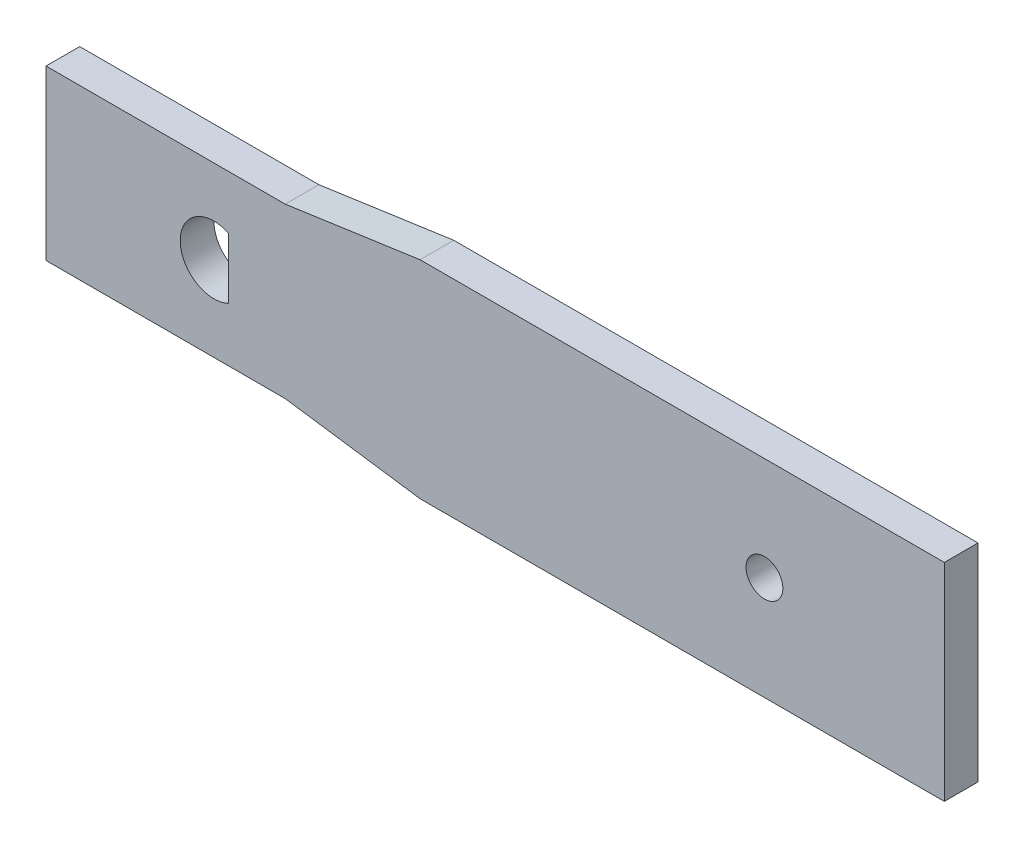
ISO-10303-21;
HEADER;
FILE_DESCRIPTION(('STEP AP214'),'2;1');
FILE_NAME('part.step','',(''),(''),'','','');
FILE_SCHEMA(('AUTOMOTIVE_DESIGN { 1 0 10303 214 1 1 1 1 }'));
ENDSEC;
DATA;
#1=APPLICATION_CONTEXT('core data for automotive mechanical design processes');
#2=APPLICATION_PROTOCOL_DEFINITION('international standard','automotive_design',2000,#1);
#3=PRODUCT_CONTEXT('',#1,'mechanical');
#4=PRODUCT('Part','Part','',(#3));
#5=PRODUCT_RELATED_PRODUCT_CATEGORY('part','',(#4));
#6=PRODUCT_DEFINITION_FORMATION('','',#4);
#7=PRODUCT_DEFINITION_CONTEXT('part definition',#1,'design');
#8=PRODUCT_DEFINITION('design','',#6,#7);
#9=PRODUCT_DEFINITION_SHAPE('','',#8);
#10=(LENGTH_UNIT() NAMED_UNIT(*) SI_UNIT(.MILLI.,.METRE.));
#11=(NAMED_UNIT(*) PLANE_ANGLE_UNIT() SI_UNIT($,.RADIAN.));
#12=(NAMED_UNIT(*) SI_UNIT($,.STERADIAN.) SOLID_ANGLE_UNIT());
#13=UNCERTAINTY_MEASURE_WITH_UNIT(LENGTH_MEASURE(1.E-05),#10,'distance_accuracy_value','');
#14=(GEOMETRIC_REPRESENTATION_CONTEXT(3) GLOBAL_UNCERTAINTY_ASSIGNED_CONTEXT((#13)) GLOBAL_UNIT_ASSIGNED_CONTEXT((#10,
#11,#12)) REPRESENTATION_CONTEXT('',''));
#15=CARTESIAN_POINT('',(0.,0.,0.));
#16=DIRECTION('',(0.,0.,1.));
#17=DIRECTION('',(1.,0.,0.));
#18=AXIS2_PLACEMENT_3D('',#15,#16,#17);
#19=CARTESIAN_POINT('',(-398.2841,298.0765,3.));
#20=DIRECTION('',(0.,-1.,0.));
#21=DIRECTION('',(0.,0.,-1.));
#22=AXIS2_PLACEMENT_3D('',#19,#20,#21);
#23=PLANE('',#22);
#24=DIRECTION('',(-1.,0.,0.));
#25=VECTOR('',#24,1.);
#26=CARTESIAN_POINT('',(-398.2841,298.0765,0.));
#27=LINE('',#26,#25);
#28=CARTESIAN_POINT('',(-398.2841,298.0765,0.));
#29=VERTEX_POINT('',#28);
#30=CARTESIAN_POINT('',(-419.587365996375,298.0765,0.));
#31=VERTEX_POINT('',#30);
#32=EDGE_CURVE('E129',#29,#31,#27,.T.);
#33=ORIENTED_EDGE('',*,*,#32,.T.);
#34=DIRECTION('',(0.,0.,-1.));
#35=VECTOR('',#34,1.);
#36=CARTESIAN_POINT('',(-419.587365996375,298.0765,3.));
#37=LINE('',#36,#35);
#38=CARTESIAN_POINT('',(-419.587365996375,298.0765,3.));
#39=VERTEX_POINT('',#38);
#40=EDGE_CURVE('E11',#39,#31,#37,.T.);
#41=ORIENTED_EDGE('',*,*,#40,.F.);
#42=DIRECTION('',(-1.,0.,0.));
#43=VECTOR('',#42,1.);
#44=CARTESIAN_POINT('',(-398.2841,298.0765,3.));
#45=LINE('',#44,#43);
#46=CARTESIAN_POINT('',(-398.2841,298.0765,3.));
#47=VERTEX_POINT('',#46);
#48=EDGE_CURVE('E131',#47,#39,#45,.T.);
#49=ORIENTED_EDGE('',*,*,#48,.F.);
#50=DIRECTION('',(0.,0.,-1.));
#51=VECTOR('',#50,1.);
#52=CARTESIAN_POINT('',(-398.2841,298.0765,3.));
#53=LINE('',#52,#51);
#54=EDGE_CURVE('E149',#47,#29,#53,.T.);
#55=ORIENTED_EDGE('',*,*,#54,.T.);
#56=EDGE_LOOP('',(#33,#41,#49,#55));
#57=FACE_BOUND('',#56,.T.);
#58=ADVANCED_FACE('F33',(#57),#23,.F.);
#59=CARTESIAN_POINT('',(-419.587365996375,298.0765,3.));
#60=DIRECTION('',(1.,0.,0.));
#61=DIRECTION('',(0.,1.,0.));
#62=AXIS2_PLACEMENT_3D('',#59,#60,#61);
#63=PLANE('',#62);
#64=DIRECTION('',(0.,-1.,0.));
#65=VECTOR('',#64,1.);
#66=CARTESIAN_POINT('',(-419.587365996375,298.0765,0.));
#67=LINE('',#66,#65);
#68=CARTESIAN_POINT('',(-419.587365996375,283.0765,0.));
#69=VERTEX_POINT('',#68);
#70=EDGE_CURVE('E152',#31,#69,#67,.T.);
#71=ORIENTED_EDGE('',*,*,#70,.T.);
#72=DIRECTION('',(0.,0.,-1.));
#73=VECTOR('',#72,1.);
#74=CARTESIAN_POINT('',(-419.587365996375,283.0765,3.));
#75=LINE('',#74,#73);
#76=CARTESIAN_POINT('',(-419.587365996375,283.0765,3.));
#77=VERTEX_POINT('',#76);
#78=EDGE_CURVE('E40',#77,#69,#75,.T.);
#79=ORIENTED_EDGE('',*,*,#78,.F.);
#80=DIRECTION('',(0.,-1.,0.));
#81=VECTOR('',#80,1.);
#82=CARTESIAN_POINT('',(-419.587365996375,298.0765,3.));
#83=LINE('',#82,#81);
#84=EDGE_CURVE('E134',#39,#77,#83,.T.);
#85=ORIENTED_EDGE('',*,*,#84,.F.);
#86=ORIENTED_EDGE('',*,*,#40,.T.);
#87=EDGE_LOOP('',(#71,#79,#85,#86));
#88=FACE_BOUND('',#87,.T.);
#89=ADVANCED_FACE('F207',(#88),#63,.F.);
#90=CARTESIAN_POINT('',(-398.2841,283.0765,3.));
#91=DIRECTION('',(0.,1.,0.));
#92=DIRECTION('',(0.,0.,1.));
#93=AXIS2_PLACEMENT_3D('',#90,#91,#92);
#94=PLANE('',#93);
#95=DIRECTION('',(1.,0.,0.));
#96=VECTOR('',#95,1.);
#97=CARTESIAN_POINT('',(-398.2841,283.0765,0.));
#98=LINE('',#97,#96);
#99=CARTESIAN_POINT('',(-398.2841,283.0765,0.));
#100=VERTEX_POINT('',#99);
#101=EDGE_CURVE('E154',#69,#100,#98,.T.);
#102=ORIENTED_EDGE('',*,*,#101,.T.);
#103=DIRECTION('',(0.,0.,-1.));
#104=VECTOR('',#103,1.);
#105=CARTESIAN_POINT('',(-398.2841,283.0765,3.));
#106=LINE('',#105,#104);
#107=CARTESIAN_POINT('',(-398.2841,283.0765,3.));
#108=VERTEX_POINT('',#107);
#109=EDGE_CURVE('E179',#108,#100,#106,.T.);
#110=ORIENTED_EDGE('',*,*,#109,.F.);
#111=DIRECTION('',(1.,0.,0.));
#112=VECTOR('',#111,1.);
#113=CARTESIAN_POINT('',(-398.2841,283.0765,3.));
#114=LINE('',#113,#112);
#115=EDGE_CURVE('E137',#77,#108,#114,.T.);
#116=ORIENTED_EDGE('',*,*,#115,.F.);
#117=ORIENTED_EDGE('',*,*,#78,.T.);
#118=EDGE_LOOP('',(#102,#110,#116,#117));
#119=FACE_BOUND('',#118,.T.);
#120=ADVANCED_FACE('F186',(#119),#94,.F.);
#121=CARTESIAN_POINT('',(-386.271234014353,281.358737399269,3.));
#122=DIRECTION('',(0.141553707912296,0.98993057725089,0.));
#123=DIRECTION('',(-0.98993057725089,0.141553707912296,0.));
#124=AXIS2_PLACEMENT_3D('',#121,#122,#123);
#125=PLANE('',#124);
#126=DIRECTION('',(0.98993057725089,-0.141553707912296,0.));
#127=VECTOR('',#126,1.);
#128=CARTESIAN_POINT('',(-386.271234014353,281.358737399269,0.));
#129=LINE('',#128,#127);
#130=CARTESIAN_POINT('',(-386.271234014353,281.358737399269,0.));
#131=VERTEX_POINT('',#130);
#132=EDGE_CURVE('E156',#100,#131,#129,.T.);
#133=ORIENTED_EDGE('',*,*,#132,.T.);
#134=DIRECTION('',(0.,0.,-1.));
#135=VECTOR('',#134,1.);
#136=CARTESIAN_POINT('',(-386.271234014353,281.358737399269,3.));
#137=LINE('',#136,#135);
#138=CARTESIAN_POINT('',(-386.271234014353,281.358737399269,3.));
#139=VERTEX_POINT('',#138);
#140=EDGE_CURVE('E176',#139,#131,#137,.T.);
#141=ORIENTED_EDGE('',*,*,#140,.F.);
#142=DIRECTION('',(0.98993057725089,-0.141553707912296,0.));
#143=VECTOR('',#142,1.);
#144=CARTESIAN_POINT('',(-386.271234014353,281.358737399269,3.));
#145=LINE('',#144,#143);
#146=EDGE_CURVE('E139',#108,#139,#145,.T.);
#147=ORIENTED_EDGE('',*,*,#146,.F.);
#148=ORIENTED_EDGE('',*,*,#109,.T.);
#149=EDGE_LOOP('',(#133,#141,#147,#148));
#150=FACE_BOUND('',#149,.T.);
#151=ADVANCED_FACE('F197',(#150),#125,.F.);
#152=CARTESIAN_POINT('',(-339.587365996375,281.358737399269,3.));
#153=DIRECTION('',(0.,1.,0.));
#154=DIRECTION('',(0.,0.,1.));
#155=AXIS2_PLACEMENT_3D('',#152,#153,#154);
#156=PLANE('',#155);
#157=DIRECTION('',(1.,0.,0.));
#158=VECTOR('',#157,1.);
#159=CARTESIAN_POINT('',(-339.587365996375,281.358737399269,0.));
#160=LINE('',#159,#158);
#161=CARTESIAN_POINT('',(-339.587365996375,281.358737399269,0.));
#162=VERTEX_POINT('',#161);
#163=EDGE_CURVE('E158',#131,#162,#160,.T.);
#164=ORIENTED_EDGE('',*,*,#163,.T.);
#165=DIRECTION('',(0.,0.,-1.));
#166=VECTOR('',#165,1.);
#167=CARTESIAN_POINT('',(-339.587365996375,281.358737399269,3.));
#168=LINE('',#167,#166);
#169=CARTESIAN_POINT('',(-339.587365996375,281.358737399269,3.));
#170=VERTEX_POINT('',#169);
#171=EDGE_CURVE('E173',#170,#162,#168,.T.);
#172=ORIENTED_EDGE('',*,*,#171,.F.);
#173=DIRECTION('',(1.,0.,0.));
#174=VECTOR('',#173,1.);
#175=CARTESIAN_POINT('',(-339.587365996375,281.358737399269,3.));
#176=LINE('',#175,#174);
#177=EDGE_CURVE('E141',#139,#170,#176,.T.);
#178=ORIENTED_EDGE('',*,*,#177,.F.);
#179=ORIENTED_EDGE('',*,*,#140,.T.);
#180=EDGE_LOOP('',(#164,#172,#178,#179));
#181=FACE_BOUND('',#180,.T.);
#182=ADVANCED_FACE('F201',(#181),#156,.F.);
#183=CARTESIAN_POINT('',(-339.587365996375,299.794262600731,3.));
#184=DIRECTION('',(-1.,0.,0.));
#185=DIRECTION('',(0.,0.,1.));
#186=AXIS2_PLACEMENT_3D('',#183,#184,#185);
#187=PLANE('',#186);
#188=DIRECTION('',(0.,1.,0.));
#189=VECTOR('',#188,1.);
#190=CARTESIAN_POINT('',(-339.587365996375,299.794262600731,0.));
#191=LINE('',#190,#189);
#192=CARTESIAN_POINT('',(-339.587365996375,299.794262600731,0.));
#193=VERTEX_POINT('',#192);
#194=EDGE_CURVE('E160',#162,#193,#191,.T.);
#195=ORIENTED_EDGE('',*,*,#194,.T.);
#196=DIRECTION('',(0.,0.,-1.));
#197=VECTOR('',#196,1.);
#198=CARTESIAN_POINT('',(-339.587365996375,299.794262600731,3.));
#199=LINE('',#198,#197);
#200=CARTESIAN_POINT('',(-339.587365996375,299.794262600731,3.));
#201=VERTEX_POINT('',#200);
#202=EDGE_CURVE('E170',#201,#193,#199,.T.);
#203=ORIENTED_EDGE('',*,*,#202,.F.);
#204=DIRECTION('',(0.,1.,0.));
#205=VECTOR('',#204,1.);
#206=CARTESIAN_POINT('',(-339.587365996375,299.794262600731,3.));
#207=LINE('',#206,#205);
#208=EDGE_CURVE('E143',#170,#201,#207,.T.);
#209=ORIENTED_EDGE('',*,*,#208,.F.);
#210=ORIENTED_EDGE('',*,*,#171,.T.);
#211=EDGE_LOOP('',(#195,#203,#209,#210));
#212=FACE_BOUND('',#211,.T.);
#213=ADVANCED_FACE('F220',(#212),#187,.F.);
#214=CARTESIAN_POINT('',(-386.271234014353,299.794262600731,3.));
#215=DIRECTION('',(0.,-1.,0.));
#216=DIRECTION('',(0.,0.,-1.));
#217=AXIS2_PLACEMENT_3D('',#214,#215,#216);
#218=PLANE('',#217);
#219=DIRECTION('',(-1.,0.,0.));
#220=VECTOR('',#219,1.);
#221=CARTESIAN_POINT('',(-386.271234014353,299.794262600731,0.));
#222=LINE('',#221,#220);
#223=CARTESIAN_POINT('',(-386.271234014353,299.794262600731,0.));
#224=VERTEX_POINT('',#223);
#225=EDGE_CURVE('E162',#193,#224,#222,.T.);
#226=ORIENTED_EDGE('',*,*,#225,.T.);
#227=DIRECTION('',(0.,0.,-1.));
#228=VECTOR('',#227,1.);
#229=CARTESIAN_POINT('',(-386.271234014353,299.794262600731,3.));
#230=LINE('',#229,#228);
#231=CARTESIAN_POINT('',(-386.271234014353,299.794262600731,3.));
#232=VERTEX_POINT('',#231);
#233=EDGE_CURVE('E167',#232,#224,#230,.T.);
#234=ORIENTED_EDGE('',*,*,#233,.F.);
#235=DIRECTION('',(-1.,0.,0.));
#236=VECTOR('',#235,1.);
#237=CARTESIAN_POINT('',(-386.271234014353,299.794262600731,3.));
#238=LINE('',#237,#236);
#239=EDGE_CURVE('E145',#201,#232,#238,.T.);
#240=ORIENTED_EDGE('',*,*,#239,.F.);
#241=ORIENTED_EDGE('',*,*,#202,.T.);
#242=EDGE_LOOP('',(#226,#234,#240,#241));
#243=FACE_BOUND('',#242,.T.);
#244=ADVANCED_FACE('F218',(#243),#218,.F.);
#245=CARTESIAN_POINT('',(-398.2841,298.0765,3.));
#246=DIRECTION('',(0.141553707912296,-0.98993057725089,0.));
#247=DIRECTION('',(0.98993057725089,0.141553707912296,0.));
#248=AXIS2_PLACEMENT_3D('',#245,#246,#247);
#249=PLANE('',#248);
#250=DIRECTION('',(-0.98993057725089,-0.141553707912296,0.));
#251=VECTOR('',#250,1.);
#252=CARTESIAN_POINT('',(-398.2841,298.0765,0.));
#253=LINE('',#252,#251);
#254=EDGE_CURVE('E135',#224,#29,#253,.T.);
#255=ORIENTED_EDGE('',*,*,#254,.T.);
#256=ORIENTED_EDGE('',*,*,#54,.F.);
#257=DIRECTION('',(-0.98993057725089,-0.141553707912296,0.));
#258=VECTOR('',#257,1.);
#259=CARTESIAN_POINT('',(-398.2841,298.0765,3.));
#260=LINE('',#259,#258);
#261=EDGE_CURVE('E147',#232,#47,#260,.T.);
#262=ORIENTED_EDGE('',*,*,#261,.F.);
#263=ORIENTED_EDGE('',*,*,#233,.T.);
#264=EDGE_LOOP('',(#255,#256,#262,#263));
#265=FACE_BOUND('',#264,.T.);
#266=ADVANCED_FACE('F213',(#265),#249,.F.);
#267=CARTESIAN_POINT('',(0.,0.,3.));
#268=DIRECTION('',(0.,0.,1.));
#269=DIRECTION('',(1.,0.,0.));
#270=AXIS2_PLACEMENT_3D('',#267,#268,#269);
#271=PLANE('',#270);
#272=CARTESIAN_POINT('',(-355.605649248184,290.599611149048,3.));
#273=DIRECTION('',(0.,0.,-1.));
#274=DIRECTION('',(-1.,0.,0.));
#275=AXIS2_PLACEMENT_3D('',#272,#273,#274);
#276=CIRCLE('',#275,1.63999999999995);
#277=CARTESIAN_POINT('',(-357.245649248184,290.599611149048,3.));
#278=VERTEX_POINT('',#277);
#279=EDGE_CURVE('E127',#278,#278,#276,.T.);
#280=ORIENTED_EDGE('',*,*,#279,.T.);
#281=EDGE_LOOP('',(#280));
#282=FACE_BOUND('',#281,.T.);
#283=CARTESIAN_POINT('',(-404.633554744729,290.599611149048,3.));
#284=DIRECTION('',(0.,0.,-1.));
#285=DIRECTION('',(-1.,0.,0.));
#286=AXIS2_PLACEMENT_3D('',#283,#284,#285);
#287=CIRCLE('',#286,3.00209450347767);
#288=CARTESIAN_POINT('',(-403.32108706596,287.899611149048,3.));
#289=VERTEX_POINT('',#288);
#290=CARTESIAN_POINT('',(-403.321087065961,293.299611149048,3.));
#291=VERTEX_POINT('',#290);
#292=EDGE_CURVE('E47',#289,#291,#287,.T.);
#293=ORIENTED_EDGE('',*,*,#292,.T.);
#294=DIRECTION('',(0.,-1.,0.));
#295=VECTOR('',#294,1.);
#296=CARTESIAN_POINT('',(-403.321087065961,293.299611149048,3.));
#297=LINE('',#296,#295);
#298=EDGE_CURVE('E112',#291,#289,#297,.T.);
#299=ORIENTED_EDGE('',*,*,#298,.T.);
#300=EDGE_LOOP('',(#293,#299));
#301=FACE_BOUND('',#300,.T.);
#302=ORIENTED_EDGE('',*,*,#48,.T.);
#303=ORIENTED_EDGE('',*,*,#84,.T.);
#304=ORIENTED_EDGE('',*,*,#115,.T.);
#305=ORIENTED_EDGE('',*,*,#146,.T.);
#306=ORIENTED_EDGE('',*,*,#177,.T.);
#307=ORIENTED_EDGE('',*,*,#208,.T.);
#308=ORIENTED_EDGE('',*,*,#239,.T.);
#309=ORIENTED_EDGE('',*,*,#261,.T.);
#310=EDGE_LOOP('',(#302,#303,#304,#305,#306,#307,#308,#309));
#311=FACE_BOUND('',#310,.T.);
#312=ADVANCED_FACE('F118',(#282,#301,#311),#271,.T.);
#313=CARTESIAN_POINT('',(0.,0.,0.));
#314=DIRECTION('',(0.,0.,1.));
#315=DIRECTION('',(1.,0.,0.));
#316=AXIS2_PLACEMENT_3D('',#313,#314,#315);
#317=PLANE('',#316);
#318=CARTESIAN_POINT('',(-355.605649248184,290.599611149048,0.));
#319=DIRECTION('',(0.,0.,-1.));
#320=DIRECTION('',(-1.,0.,0.));
#321=AXIS2_PLACEMENT_3D('',#318,#319,#320);
#322=CIRCLE('',#321,1.63999999999995);
#323=CARTESIAN_POINT('',(-357.245649248184,290.599611149048,0.));
#324=VERTEX_POINT('',#323);
#325=EDGE_CURVE('E124',#324,#324,#322,.T.);
#326=ORIENTED_EDGE('',*,*,#325,.F.);
#327=EDGE_LOOP('',(#326));
#328=FACE_BOUND('',#327,.T.);
#329=DIRECTION('',(0.,-1.,0.));
#330=VECTOR('',#329,1.);
#331=CARTESIAN_POINT('',(-403.321087065961,293.299611149048,0.));
#332=LINE('',#331,#330);
#333=CARTESIAN_POINT('',(-403.321087065961,293.299611149048,0.));
#334=VERTEX_POINT('',#333);
#335=CARTESIAN_POINT('',(-403.32108706596,287.899611149048,0.));
#336=VERTEX_POINT('',#335);
#337=EDGE_CURVE('E120',#334,#336,#332,.T.);
#338=ORIENTED_EDGE('',*,*,#337,.F.);
#339=CARTESIAN_POINT('',(-404.633554744729,290.599611149048,0.));
#340=DIRECTION('',(0.,0.,-1.));
#341=DIRECTION('',(-1.,0.,0.));
#342=AXIS2_PLACEMENT_3D('',#339,#340,#341);
#343=CIRCLE('',#342,3.00209450347767);
#344=EDGE_CURVE('E52',#336,#334,#343,.T.);
#345=ORIENTED_EDGE('',*,*,#344,.F.);
#346=EDGE_LOOP('',(#338,#345));
#347=FACE_BOUND('',#346,.T.);
#348=ORIENTED_EDGE('',*,*,#32,.F.);
#349=ORIENTED_EDGE('',*,*,#254,.F.);
#350=ORIENTED_EDGE('',*,*,#225,.F.);
#351=ORIENTED_EDGE('',*,*,#194,.F.);
#352=ORIENTED_EDGE('',*,*,#163,.F.);
#353=ORIENTED_EDGE('',*,*,#132,.F.);
#354=ORIENTED_EDGE('',*,*,#101,.F.);
#355=ORIENTED_EDGE('',*,*,#70,.F.);
#356=EDGE_LOOP('',(#348,#349,#350,#351,#352,#353,#354,#355));
#357=FACE_BOUND('',#356,.T.);
#358=ADVANCED_FACE('F192',(#328,#347,#357),#317,.F.);
#359=CARTESIAN_POINT('',(-404.633554744729,290.599611149048,3.));
#360=DIRECTION('',(0.,0.,-1.));
#361=DIRECTION('',(-1.,0.,0.));
#362=AXIS2_PLACEMENT_3D('',#359,#360,#361);
#363=CYLINDRICAL_SURFACE('',#362,3.00209450347767);
#364=ORIENTED_EDGE('',*,*,#344,.T.);
#365=DIRECTION('',(0.,0.,-1.));
#366=VECTOR('',#365,1.);
#367=CARTESIAN_POINT('',(-403.321087065961,293.299611149048,3.));
#368=LINE('',#367,#366);
#369=EDGE_CURVE('E105',#291,#334,#368,.T.);
#370=ORIENTED_EDGE('',*,*,#369,.F.);
#371=ORIENTED_EDGE('',*,*,#292,.F.);
#372=DIRECTION('',(0.,0.,-1.));
#373=VECTOR('',#372,1.);
#374=CARTESIAN_POINT('',(-403.32108706596,287.899611149048,3.));
#375=LINE('',#374,#373);
#376=EDGE_CURVE('E111',#289,#336,#375,.T.);
#377=ORIENTED_EDGE('',*,*,#376,.T.);
#378=EDGE_LOOP('',(#364,#370,#371,#377));
#379=FACE_BOUND('',#378,.T.);
#380=ADVANCED_FACE('F107',(#379),#363,.F.);
#381=CARTESIAN_POINT('',(-403.321087065961,293.299611149048,3.));
#382=DIRECTION('',(1.,0.,0.));
#383=DIRECTION('',(0.,1.,0.));
#384=AXIS2_PLACEMENT_3D('',#381,#382,#383);
#385=PLANE('',#384);
#386=ORIENTED_EDGE('',*,*,#337,.T.);
#387=ORIENTED_EDGE('',*,*,#376,.F.);
#388=ORIENTED_EDGE('',*,*,#298,.F.);
#389=ORIENTED_EDGE('',*,*,#369,.T.);
#390=EDGE_LOOP('',(#386,#387,#388,#389));
#391=FACE_BOUND('',#390,.T.);
#392=ADVANCED_FACE('F115',(#391),#385,.F.);
#393=CARTESIAN_POINT('',(-355.605649248184,290.599611149048,3.));
#394=DIRECTION('',(0.,0.,-1.));
#395=DIRECTION('',(-1.,0.,0.));
#396=AXIS2_PLACEMENT_3D('',#393,#394,#395);
#397=CYLINDRICAL_SURFACE('',#396,1.63999999999995);
#398=ORIENTED_EDGE('',*,*,#279,.F.);
#399=EDGE_LOOP('',(#398));
#400=FACE_BOUND('',#399,.T.);
#401=ORIENTED_EDGE('',*,*,#325,.T.);
#402=EDGE_LOOP('',(#401));
#403=FACE_BOUND('',#402,.T.);
#404=ADVANCED_FACE('F286',(#400,#403),#397,.F.);
#405=CLOSED_SHELL('',(#58,#89,#120,#151,#182,#213,#244,#266,#312,#358,#380,#392,#404));
#406=MANIFOLD_SOLID_BREP('B2',#405);
#407=ADVANCED_BREP_SHAPE_REPRESENTATION('',(#18,#406),#14);
#408=SHAPE_DEFINITION_REPRESENTATION(#9,#407);
ENDSEC;
END-ISO-10303-21;
